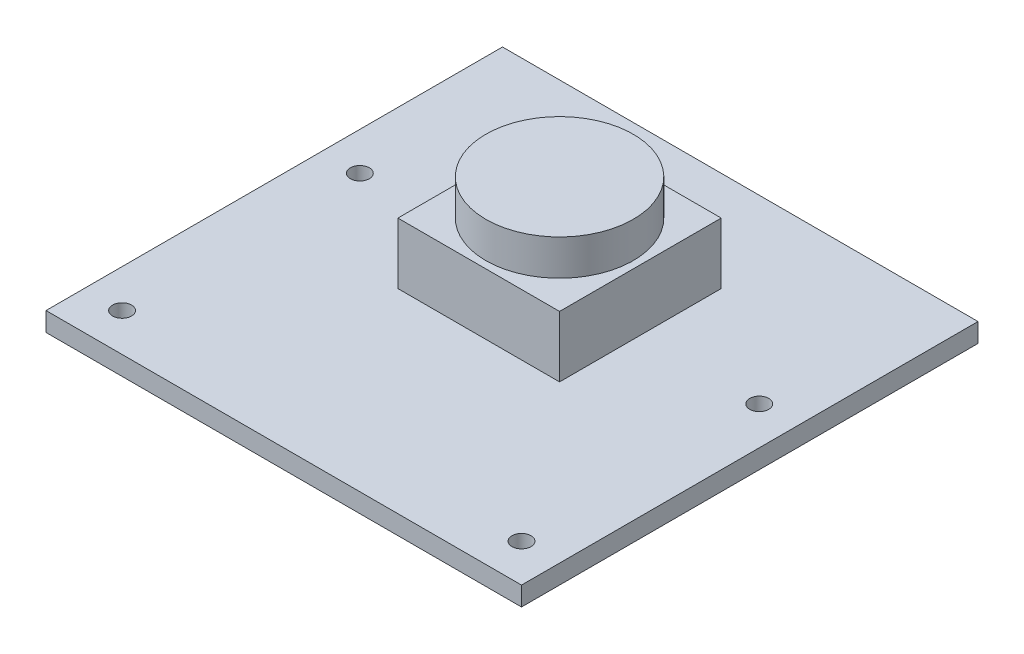
ISO-10303-21;
HEADER;
FILE_DESCRIPTION(('STEP AP214'),'2;1');
FILE_NAME('part.step','',(''),(''),'','','');
FILE_SCHEMA(('AUTOMOTIVE_DESIGN { 1 0 10303 214 1 1 1 1 }'));
ENDSEC;
DATA;
#1=APPLICATION_CONTEXT('core data for automotive mechanical design processes');
#2=APPLICATION_PROTOCOL_DEFINITION('international standard','automotive_design',2000,#1);
#3=PRODUCT_CONTEXT('',#1,'mechanical');
#4=PRODUCT('Part','Part','',(#3));
#5=PRODUCT_RELATED_PRODUCT_CATEGORY('part','',(#4));
#6=PRODUCT_DEFINITION_FORMATION('','',#4);
#7=PRODUCT_DEFINITION_CONTEXT('part definition',#1,'design');
#8=PRODUCT_DEFINITION('design','',#6,#7);
#9=PRODUCT_DEFINITION_SHAPE('','',#8);
#10=(LENGTH_UNIT() NAMED_UNIT(*) SI_UNIT(.MILLI.,.METRE.));
#11=(NAMED_UNIT(*) PLANE_ANGLE_UNIT() SI_UNIT($,.RADIAN.));
#12=(NAMED_UNIT(*) SI_UNIT($,.STERADIAN.) SOLID_ANGLE_UNIT());
#13=UNCERTAINTY_MEASURE_WITH_UNIT(LENGTH_MEASURE(1.E-05),#10,'distance_accuracy_value','');
#14=(GEOMETRIC_REPRESENTATION_CONTEXT(3) GLOBAL_UNCERTAINTY_ASSIGNED_CONTEXT((#13)) GLOBAL_UNIT_ASSIGNED_CONTEXT((#10,
#11,#12)) REPRESENTATION_CONTEXT('',''));
#15=CARTESIAN_POINT('',(0.,0.,0.));
#16=DIRECTION('',(0.,0.,1.));
#17=DIRECTION('',(1.,0.,0.));
#18=AXIS2_PLACEMENT_3D('',#15,#16,#17);
#19=CARTESIAN_POINT('',(0.,1.,0.));
#20=DIRECTION('',(0.,-1.,0.));
#21=DIRECTION('',(0.,0.,-1.));
#22=AXIS2_PLACEMENT_3D('',#19,#20,#21);
#23=PLANE('',#22);
#24=DIRECTION('',(0.,0.,-1.));
#25=VECTOR('',#24,1.);
#26=CARTESIAN_POINT('',(12.5,1.,12.));
#27=LINE('',#26,#25);
#28=CARTESIAN_POINT('',(12.5,1.,12.));
#29=VERTEX_POINT('',#28);
#30=CARTESIAN_POINT('',(12.5,1.,-12.));
#31=VERTEX_POINT('',#30);
#32=EDGE_CURVE('E152',#29,#31,#27,.T.);
#33=ORIENTED_EDGE('',*,*,#32,.T.);
#34=DIRECTION('',(-1.,0.,0.));
#35=VECTOR('',#34,1.);
#36=CARTESIAN_POINT('',(-12.5,1.,-12.));
#37=LINE('',#36,#35);
#38=CARTESIAN_POINT('',(-12.5,1.,-12.));
#39=VERTEX_POINT('',#38);
#40=EDGE_CURVE('E155',#31,#39,#37,.T.);
#41=ORIENTED_EDGE('',*,*,#40,.T.);
#42=DIRECTION('',(0.,0.,1.));
#43=VECTOR('',#42,1.);
#44=CARTESIAN_POINT('',(-12.5,1.,12.));
#45=LINE('',#44,#43);
#46=CARTESIAN_POINT('',(-12.5,1.,12.));
#47=VERTEX_POINT('',#46);
#48=EDGE_CURVE('E158',#39,#47,#45,.T.);
#49=ORIENTED_EDGE('',*,*,#48,.T.);
#50=DIRECTION('',(1.,0.,0.));
#51=VECTOR('',#50,1.);
#52=CARTESIAN_POINT('',(-12.5,1.,12.));
#53=LINE('',#52,#51);
#54=EDGE_CURVE('E160',#47,#29,#53,.T.);
#55=ORIENTED_EDGE('',*,*,#54,.T.);
#56=EDGE_LOOP('',(#33,#41,#49,#55));
#57=FACE_BOUND('',#56,.T.);
#58=CARTESIAN_POINT('',(-10.5,1.,10.));
#59=DIRECTION('',(0.,1.,0.));
#60=DIRECTION('',(0.,0.,1.));
#61=AXIS2_PLACEMENT_3D('',#58,#59,#60);
#62=CIRCLE('',#61,0.500000000000001);
#63=CARTESIAN_POINT('',(-10.5,1.,10.5));
#64=VERTEX_POINT('',#63);
#65=EDGE_CURVE('E137',#64,#64,#62,.T.);
#66=ORIENTED_EDGE('',*,*,#65,.F.);
#67=EDGE_LOOP('',(#66));
#68=FACE_BOUND('',#67,.T.);
#69=CARTESIAN_POINT('',(10.5,1.,-2.5));
#70=DIRECTION('',(0.,1.,0.));
#71=DIRECTION('',(0.,0.,-1.));
#72=AXIS2_PLACEMENT_3D('',#69,#70,#71);
#73=CIRCLE('',#72,0.500000000000001);
#74=CARTESIAN_POINT('',(10.5,1.,-3.));
#75=VERTEX_POINT('',#74);
#76=EDGE_CURVE('E122',#75,#75,#73,.T.);
#77=ORIENTED_EDGE('',*,*,#76,.F.);
#78=EDGE_LOOP('',(#77));
#79=FACE_BOUND('',#78,.T.);
#80=CARTESIAN_POINT('',(-10.5,1.,-2.5));
#81=DIRECTION('',(0.,1.,0.));
#82=DIRECTION('',(0.,0.,1.));
#83=AXIS2_PLACEMENT_3D('',#80,#81,#82);
#84=CIRCLE('',#83,0.500000000000001);
#85=CARTESIAN_POINT('',(-10.5,1.,-2.));
#86=VERTEX_POINT('',#85);
#87=EDGE_CURVE('E132',#86,#86,#84,.T.);
#88=ORIENTED_EDGE('',*,*,#87,.F.);
#89=EDGE_LOOP('',(#88));
#90=FACE_BOUND('',#89,.T.);
#91=CARTESIAN_POINT('',(10.5,1.,10.));
#92=DIRECTION('',(0.,1.,0.));
#93=DIRECTION('',(0.,0.,-1.));
#94=AXIS2_PLACEMENT_3D('',#91,#92,#93);
#95=CIRCLE('',#94,0.500000000000001);
#96=CARTESIAN_POINT('',(10.5,1.,9.5));
#97=VERTEX_POINT('',#96);
#98=EDGE_CURVE('E138',#97,#97,#95,.T.);
#99=ORIENTED_EDGE('',*,*,#98,.F.);
#100=EDGE_LOOP('',(#99));
#101=FACE_BOUND('',#100,.T.);
#102=DIRECTION('',(0.,0.,-1.));
#103=VECTOR('',#102,1.);
#104=CARTESIAN_POINT('',(4.25,1.,1.75));
#105=LINE('',#104,#103);
#106=CARTESIAN_POINT('',(4.25,1.,1.75));
#107=VERTEX_POINT('',#106);
#108=CARTESIAN_POINT('',(4.25,1.,-6.75));
#109=VERTEX_POINT('',#108);
#110=EDGE_CURVE('E121',#107,#109,#105,.T.);
#111=ORIENTED_EDGE('',*,*,#110,.F.);
#112=DIRECTION('',(1.,0.,0.));
#113=VECTOR('',#112,1.);
#114=CARTESIAN_POINT('',(-4.25,1.,1.75));
#115=LINE('',#114,#113);
#116=CARTESIAN_POINT('',(-4.25,1.,1.75));
#117=VERTEX_POINT('',#116);
#118=EDGE_CURVE('E118',#117,#107,#115,.T.);
#119=ORIENTED_EDGE('',*,*,#118,.F.);
#120=DIRECTION('',(0.,0.,1.));
#121=VECTOR('',#120,1.);
#122=CARTESIAN_POINT('',(-4.25,1.,1.75));
#123=LINE('',#122,#121);
#124=CARTESIAN_POINT('',(-4.25,1.,-6.75));
#125=VERTEX_POINT('',#124);
#126=EDGE_CURVE('E56',#125,#117,#123,.T.);
#127=ORIENTED_EDGE('',*,*,#126,.F.);
#128=DIRECTION('',(-1.,0.,0.));
#129=VECTOR('',#128,1.);
#130=CARTESIAN_POINT('',(-4.25,1.,-6.75));
#131=LINE('',#130,#129);
#132=EDGE_CURVE('E51',#109,#125,#131,.T.);
#133=ORIENTED_EDGE('',*,*,#132,.F.);
#134=EDGE_LOOP('',(#111,#119,#127,#133));
#135=FACE_BOUND('',#134,.T.);
#136=ADVANCED_FACE('F35',(#57,#68,#79,#90,#101,#135),#23,.F.);
#137=CARTESIAN_POINT('',(12.5,1.,12.));
#138=DIRECTION('',(-1.,0.,0.));
#139=DIRECTION('',(0.,0.,1.));
#140=AXIS2_PLACEMENT_3D('',#137,#138,#139);
#141=PLANE('',#140);
#142=DIRECTION('',(0.,0.,-1.));
#143=VECTOR('',#142,1.);
#144=CARTESIAN_POINT('',(12.5,0.,12.));
#145=LINE('',#144,#143);
#146=CARTESIAN_POINT('',(12.5,0.,12.));
#147=VERTEX_POINT('',#146);
#148=CARTESIAN_POINT('',(12.5,0.,-12.));
#149=VERTEX_POINT('',#148);
#150=EDGE_CURVE('E149',#147,#149,#145,.T.);
#151=ORIENTED_EDGE('',*,*,#150,.T.);
#152=DIRECTION('',(0.,-1.,0.));
#153=VECTOR('',#152,1.);
#154=CARTESIAN_POINT('',(12.5,1.,-12.));
#155=LINE('',#154,#153);
#156=EDGE_CURVE('E39',#31,#149,#155,.T.);
#157=ORIENTED_EDGE('',*,*,#156,.F.);
#158=ORIENTED_EDGE('',*,*,#32,.F.);
#159=DIRECTION('',(0.,-1.,0.));
#160=VECTOR('',#159,1.);
#161=CARTESIAN_POINT('',(12.5,1.,12.));
#162=LINE('',#161,#160);
#163=EDGE_CURVE('E162',#29,#147,#162,.T.);
#164=ORIENTED_EDGE('',*,*,#163,.T.);
#165=EDGE_LOOP('',(#151,#157,#158,#164));
#166=FACE_BOUND('',#165,.T.);
#167=ADVANCED_FACE('F37',(#166),#141,.F.);
#168=CARTESIAN_POINT('',(-12.5,1.,-12.));
#169=DIRECTION('',(0.,0.,1.));
#170=DIRECTION('',(1.,0.,0.));
#171=AXIS2_PLACEMENT_3D('',#168,#169,#170);
#172=PLANE('',#171);
#173=DIRECTION('',(-1.,0.,0.));
#174=VECTOR('',#173,1.);
#175=CARTESIAN_POINT('',(-12.5,0.,-12.));
#176=LINE('',#175,#174);
#177=CARTESIAN_POINT('',(-12.5,0.,-12.));
#178=VERTEX_POINT('',#177);
#179=EDGE_CURVE('E165',#149,#178,#176,.T.);
#180=ORIENTED_EDGE('',*,*,#179,.T.);
#181=DIRECTION('',(0.,-1.,0.));
#182=VECTOR('',#181,1.);
#183=CARTESIAN_POINT('',(-12.5,1.,-12.));
#184=LINE('',#183,#182);
#185=EDGE_CURVE('E174',#39,#178,#184,.T.);
#186=ORIENTED_EDGE('',*,*,#185,.F.);
#187=ORIENTED_EDGE('',*,*,#40,.F.);
#188=ORIENTED_EDGE('',*,*,#156,.T.);
#189=EDGE_LOOP('',(#180,#186,#187,#188));
#190=FACE_BOUND('',#189,.T.);
#191=ADVANCED_FACE('F183',(#190),#172,.F.);
#192=CARTESIAN_POINT('',(-12.5,1.,12.));
#193=DIRECTION('',(1.,0.,0.));
#194=DIRECTION('',(0.,0.,-1.));
#195=AXIS2_PLACEMENT_3D('',#192,#193,#194);
#196=PLANE('',#195);
#197=DIRECTION('',(0.,0.,1.));
#198=VECTOR('',#197,1.);
#199=CARTESIAN_POINT('',(-12.5,0.,12.));
#200=LINE('',#199,#198);
#201=CARTESIAN_POINT('',(-12.5,0.,12.));
#202=VERTEX_POINT('',#201);
#203=EDGE_CURVE('E167',#178,#202,#200,.T.);
#204=ORIENTED_EDGE('',*,*,#203,.T.);
#205=DIRECTION('',(0.,-1.,0.));
#206=VECTOR('',#205,1.);
#207=CARTESIAN_POINT('',(-12.5,1.,12.));
#208=LINE('',#207,#206);
#209=EDGE_CURVE('E172',#47,#202,#208,.T.);
#210=ORIENTED_EDGE('',*,*,#209,.F.);
#211=ORIENTED_EDGE('',*,*,#48,.F.);
#212=ORIENTED_EDGE('',*,*,#185,.T.);
#213=EDGE_LOOP('',(#204,#210,#211,#212));
#214=FACE_BOUND('',#213,.T.);
#215=ADVANCED_FACE('F192',(#214),#196,.F.);
#216=CARTESIAN_POINT('',(-12.5,1.,12.));
#217=DIRECTION('',(0.,0.,-1.));
#218=DIRECTION('',(-1.,0.,0.));
#219=AXIS2_PLACEMENT_3D('',#216,#217,#218);
#220=PLANE('',#219);
#221=DIRECTION('',(1.,0.,0.));
#222=VECTOR('',#221,1.);
#223=CARTESIAN_POINT('',(-12.5,0.,12.));
#224=LINE('',#223,#222);
#225=EDGE_CURVE('E156',#202,#147,#224,.T.);
#226=ORIENTED_EDGE('',*,*,#225,.T.);
#227=ORIENTED_EDGE('',*,*,#163,.F.);
#228=ORIENTED_EDGE('',*,*,#54,.F.);
#229=ORIENTED_EDGE('',*,*,#209,.T.);
#230=EDGE_LOOP('',(#226,#227,#228,#229));
#231=FACE_BOUND('',#230,.T.);
#232=ADVANCED_FACE('F195',(#231),#220,.F.);
#233=CARTESIAN_POINT('',(0.,0.,0.));
#234=DIRECTION('',(0.,-1.,0.));
#235=DIRECTION('',(0.,0.,-1.));
#236=AXIS2_PLACEMENT_3D('',#233,#234,#235);
#237=PLANE('',#236);
#238=CARTESIAN_POINT('',(10.5,0.,10.));
#239=DIRECTION('',(0.,1.,0.));
#240=DIRECTION('',(0.,0.,-1.));
#241=AXIS2_PLACEMENT_3D('',#238,#239,#240);
#242=CIRCLE('',#241,0.500000000000001);
#243=CARTESIAN_POINT('',(10.5,0.,9.5));
#244=VERTEX_POINT('',#243);
#245=EDGE_CURVE('E134',#244,#244,#242,.T.);
#246=ORIENTED_EDGE('',*,*,#245,.T.);
#247=EDGE_LOOP('',(#246));
#248=FACE_BOUND('',#247,.T.);
#249=CARTESIAN_POINT('',(-10.5,0.,-2.5));
#250=DIRECTION('',(0.,1.,0.));
#251=DIRECTION('',(0.,0.,1.));
#252=AXIS2_PLACEMENT_3D('',#249,#250,#251);
#253=CIRCLE('',#252,0.500000000000001);
#254=CARTESIAN_POINT('',(-10.5,0.,-2.));
#255=VERTEX_POINT('',#254);
#256=EDGE_CURVE('E141',#255,#255,#253,.T.);
#257=ORIENTED_EDGE('',*,*,#256,.T.);
#258=EDGE_LOOP('',(#257));
#259=FACE_BOUND('',#258,.T.);
#260=CARTESIAN_POINT('',(10.5,0.,-2.5));
#261=DIRECTION('',(0.,1.,0.));
#262=DIRECTION('',(0.,0.,-1.));
#263=AXIS2_PLACEMENT_3D('',#260,#261,#262);
#264=CIRCLE('',#263,0.500000000000001);
#265=CARTESIAN_POINT('',(10.5,0.,-3.));
#266=VERTEX_POINT('',#265);
#267=EDGE_CURVE('E125',#266,#266,#264,.T.);
#268=ORIENTED_EDGE('',*,*,#267,.T.);
#269=EDGE_LOOP('',(#268));
#270=FACE_BOUND('',#269,.T.);
#271=CARTESIAN_POINT('',(-10.5,0.,10.));
#272=DIRECTION('',(0.,1.,0.));
#273=DIRECTION('',(0.,0.,1.));
#274=AXIS2_PLACEMENT_3D('',#271,#272,#273);
#275=CIRCLE('',#274,0.500000000000001);
#276=CARTESIAN_POINT('',(-10.5,0.,10.5));
#277=VERTEX_POINT('',#276);
#278=EDGE_CURVE('E146',#277,#277,#275,.T.);
#279=ORIENTED_EDGE('',*,*,#278,.T.);
#280=EDGE_LOOP('',(#279));
#281=FACE_BOUND('',#280,.T.);
#282=ORIENTED_EDGE('',*,*,#150,.F.);
#283=ORIENTED_EDGE('',*,*,#225,.F.);
#284=ORIENTED_EDGE('',*,*,#203,.F.);
#285=ORIENTED_EDGE('',*,*,#179,.F.);
#286=EDGE_LOOP('',(#282,#283,#284,#285));
#287=FACE_BOUND('',#286,.T.);
#288=ADVANCED_FACE('F190',(#248,#259,#270,#281,#287),#237,.T.);
#289=CARTESIAN_POINT('',(-10.5,0.,10.));
#290=DIRECTION('',(0.,1.,0.));
#291=DIRECTION('',(0.,0.,1.));
#292=AXIS2_PLACEMENT_3D('',#289,#290,#291);
#293=CYLINDRICAL_SURFACE('',#292,0.500000000000001);
#294=ORIENTED_EDGE('',*,*,#278,.F.);
#295=EDGE_LOOP('',(#294));
#296=FACE_BOUND('',#295,.T.);
#297=ORIENTED_EDGE('',*,*,#65,.T.);
#298=EDGE_LOOP('',(#297));
#299=FACE_BOUND('',#298,.T.);
#300=ADVANCED_FACE('F254',(#296,#299),#293,.F.);
#301=CARTESIAN_POINT('',(10.5,0.,-2.5));
#302=DIRECTION('',(0.,1.,0.));
#303=DIRECTION('',(0.,0.,1.));
#304=AXIS2_PLACEMENT_3D('',#301,#302,#303);
#305=CYLINDRICAL_SURFACE('',#304,0.500000000000001);
#306=ORIENTED_EDGE('',*,*,#267,.F.);
#307=EDGE_LOOP('',(#306));
#308=FACE_BOUND('',#307,.T.);
#309=ORIENTED_EDGE('',*,*,#76,.T.);
#310=EDGE_LOOP('',(#309));
#311=FACE_BOUND('',#310,.T.);
#312=ADVANCED_FACE('F250',(#308,#311),#305,.F.);
#313=CARTESIAN_POINT('',(-10.5,0.,-2.5));
#314=DIRECTION('',(0.,1.,0.));
#315=DIRECTION('',(0.,0.,1.));
#316=AXIS2_PLACEMENT_3D('',#313,#314,#315);
#317=CYLINDRICAL_SURFACE('',#316,0.500000000000001);
#318=ORIENTED_EDGE('',*,*,#256,.F.);
#319=EDGE_LOOP('',(#318));
#320=FACE_BOUND('',#319,.T.);
#321=ORIENTED_EDGE('',*,*,#87,.T.);
#322=EDGE_LOOP('',(#321));
#323=FACE_BOUND('',#322,.T.);
#324=ADVANCED_FACE('F253',(#320,#323),#317,.F.);
#325=CARTESIAN_POINT('',(10.5,0.,10.));
#326=DIRECTION('',(0.,1.,0.));
#327=DIRECTION('',(0.,0.,1.));
#328=AXIS2_PLACEMENT_3D('',#325,#326,#327);
#329=CYLINDRICAL_SURFACE('',#328,0.500000000000001);
#330=ORIENTED_EDGE('',*,*,#245,.F.);
#331=EDGE_LOOP('',(#330));
#332=FACE_BOUND('',#331,.T.);
#333=ORIENTED_EDGE('',*,*,#98,.T.);
#334=EDGE_LOOP('',(#333));
#335=FACE_BOUND('',#334,.T.);
#336=ADVANCED_FACE('F249',(#332,#335),#329,.F.);
#337=CARTESIAN_POINT('',(4.25,4.21,1.75));
#338=DIRECTION('',(-1.,0.,0.));
#339=DIRECTION('',(0.,0.,1.));
#340=AXIS2_PLACEMENT_3D('',#337,#338,#339);
#341=PLANE('',#340);
#342=ORIENTED_EDGE('',*,*,#110,.T.);
#343=DIRECTION('',(0.,-1.,0.));
#344=VECTOR('',#343,1.);
#345=CARTESIAN_POINT('',(4.25,4.21,-6.75));
#346=LINE('',#345,#344);
#347=CARTESIAN_POINT('',(4.25,4.21,-6.75));
#348=VERTEX_POINT('',#347);
#349=EDGE_CURVE('E102',#348,#109,#346,.T.);
#350=ORIENTED_EDGE('',*,*,#349,.F.);
#351=DIRECTION('',(0.,0.,-1.));
#352=VECTOR('',#351,1.);
#353=CARTESIAN_POINT('',(4.25,4.21,1.75));
#354=LINE('',#353,#352);
#355=CARTESIAN_POINT('',(4.25,4.21,1.75));
#356=VERTEX_POINT('',#355);
#357=EDGE_CURVE('E109',#356,#348,#354,.T.);
#358=ORIENTED_EDGE('',*,*,#357,.F.);
#359=DIRECTION('',(0.,-1.,0.));
#360=VECTOR('',#359,1.);
#361=CARTESIAN_POINT('',(4.25,4.21,1.75));
#362=LINE('',#361,#360);
#363=EDGE_CURVE('E213',#356,#107,#362,.T.);
#364=ORIENTED_EDGE('',*,*,#363,.T.);
#365=EDGE_LOOP('',(#342,#350,#358,#364));
#366=FACE_BOUND('',#365,.T.);
#367=ADVANCED_FACE('F120',(#366),#341,.F.);
#368=CARTESIAN_POINT('',(-4.25,4.21,-6.75));
#369=DIRECTION('',(0.,0.,1.));
#370=DIRECTION('',(1.,0.,0.));
#371=AXIS2_PLACEMENT_3D('',#368,#369,#370);
#372=PLANE('',#371);
#373=ORIENTED_EDGE('',*,*,#132,.T.);
#374=DIRECTION('',(0.,-1.,0.));
#375=VECTOR('',#374,1.);
#376=CARTESIAN_POINT('',(-4.25,4.21,-6.75));
#377=LINE('',#376,#375);
#378=CARTESIAN_POINT('',(-4.25,4.21,-6.75));
#379=VERTEX_POINT('',#378);
#380=EDGE_CURVE('E105',#379,#125,#377,.T.);
#381=ORIENTED_EDGE('',*,*,#380,.F.);
#382=DIRECTION('',(-1.,0.,0.));
#383=VECTOR('',#382,1.);
#384=CARTESIAN_POINT('',(-4.25,4.21,-6.75));
#385=LINE('',#384,#383);
#386=EDGE_CURVE('E98',#348,#379,#385,.T.);
#387=ORIENTED_EDGE('',*,*,#386,.F.);
#388=ORIENTED_EDGE('',*,*,#349,.T.);
#389=EDGE_LOOP('',(#373,#381,#387,#388));
#390=FACE_BOUND('',#389,.T.);
#391=ADVANCED_FACE('F100',(#390),#372,.F.);
#392=CARTESIAN_POINT('',(-4.25,4.21,1.75));
#393=DIRECTION('',(1.,0.,0.));
#394=DIRECTION('',(0.,0.,-1.));
#395=AXIS2_PLACEMENT_3D('',#392,#393,#394);
#396=PLANE('',#395);
#397=ORIENTED_EDGE('',*,*,#126,.T.);
#398=DIRECTION('',(0.,-1.,0.));
#399=VECTOR('',#398,1.);
#400=CARTESIAN_POINT('',(-4.25,4.21,1.75));
#401=LINE('',#400,#399);
#402=CARTESIAN_POINT('',(-4.25,4.21,1.75));
#403=VERTEX_POINT('',#402);
#404=EDGE_CURVE('E127',#403,#117,#401,.T.);
#405=ORIENTED_EDGE('',*,*,#404,.F.);
#406=DIRECTION('',(0.,0.,1.));
#407=VECTOR('',#406,1.);
#408=CARTESIAN_POINT('',(-4.25,4.21,1.75));
#409=LINE('',#408,#407);
#410=EDGE_CURVE('E108',#379,#403,#409,.T.);
#411=ORIENTED_EDGE('',*,*,#410,.F.);
#412=ORIENTED_EDGE('',*,*,#380,.T.);
#413=EDGE_LOOP('',(#397,#405,#411,#412));
#414=FACE_BOUND('',#413,.T.);
#415=ADVANCED_FACE('F238',(#414),#396,.F.);
#416=CARTESIAN_POINT('',(-4.25,4.21,1.75));
#417=DIRECTION('',(0.,0.,-1.));
#418=DIRECTION('',(-1.,0.,0.));
#419=AXIS2_PLACEMENT_3D('',#416,#417,#418);
#420=PLANE('',#419);
#421=ORIENTED_EDGE('',*,*,#118,.T.);
#422=ORIENTED_EDGE('',*,*,#363,.F.);
#423=DIRECTION('',(1.,0.,0.));
#424=VECTOR('',#423,1.);
#425=CARTESIAN_POINT('',(-4.25,4.21,1.75));
#426=LINE('',#425,#424);
#427=EDGE_CURVE('E114',#403,#356,#426,.T.);
#428=ORIENTED_EDGE('',*,*,#427,.F.);
#429=ORIENTED_EDGE('',*,*,#404,.T.);
#430=EDGE_LOOP('',(#421,#422,#428,#429));
#431=FACE_BOUND('',#430,.T.);
#432=ADVANCED_FACE('F212',(#431),#420,.F.);
#433=CARTESIAN_POINT('',(0.,4.21,0.));
#434=DIRECTION('',(0.,-1.,0.));
#435=DIRECTION('',(0.,0.,-1.));
#436=AXIS2_PLACEMENT_3D('',#433,#434,#435);
#437=PLANE('',#436);
#438=CARTESIAN_POINT('',(0.,4.21,-2.5));
#439=DIRECTION('',(0.,1.,0.));
#440=DIRECTION('',(0.,0.,1.));
#441=AXIS2_PLACEMENT_3D('',#438,#439,#440);
#442=CIRCLE('',#441,3.87655728767913);
#443=CARTESIAN_POINT('',(0.,4.21,1.37655728767913));
#444=VERTEX_POINT('',#443);
#445=EDGE_CURVE('E11',#444,#444,#442,.T.);
#446=ORIENTED_EDGE('',*,*,#445,.F.);
#447=EDGE_LOOP('',(#446));
#448=FACE_BOUND('',#447,.T.);
#449=ORIENTED_EDGE('',*,*,#357,.T.);
#450=ORIENTED_EDGE('',*,*,#386,.T.);
#451=ORIENTED_EDGE('',*,*,#410,.T.);
#452=ORIENTED_EDGE('',*,*,#427,.T.);
#453=EDGE_LOOP('',(#449,#450,#451,#452));
#454=FACE_BOUND('',#453,.T.);
#455=ADVANCED_FACE('F112',(#448,#454),#437,.F.);
#456=CARTESIAN_POINT('',(0.,6.09,-2.5));
#457=DIRECTION('',(0.,-1.,0.));
#458=DIRECTION('',(0.,0.,-1.));
#459=AXIS2_PLACEMENT_3D('',#456,#457,#458);
#460=CYLINDRICAL_SURFACE('',#459,3.87655728767913);
#461=CARTESIAN_POINT('',(0.,6.09,-2.5));
#462=DIRECTION('',(0.,1.,0.));
#463=DIRECTION('',(0.,0.,1.));
#464=AXIS2_PLACEMENT_3D('',#461,#462,#463);
#465=CIRCLE('',#464,3.87655728767913);
#466=CARTESIAN_POINT('',(0.,6.09,1.37655728767913));
#467=VERTEX_POINT('',#466);
#468=EDGE_CURVE('E208',#467,#467,#465,.T.);
#469=ORIENTED_EDGE('',*,*,#468,.F.);
#470=EDGE_LOOP('',(#469));
#471=FACE_BOUND('',#470,.T.);
#472=ORIENTED_EDGE('',*,*,#445,.T.);
#473=EDGE_LOOP('',(#472));
#474=FACE_BOUND('',#473,.T.);
#475=ADVANCED_FACE('F227',(#471,#474),#460,.T.);
#476=CARTESIAN_POINT('',(0.,6.09,-2.5));
#477=DIRECTION('',(0.,1.,0.));
#478=DIRECTION('',(0.,0.,1.));
#479=AXIS2_PLACEMENT_3D('',#476,#477,#478);
#480=PLANE('',#479);
#481=ORIENTED_EDGE('',*,*,#468,.T.);
#482=EDGE_LOOP('',(#481));
#483=FACE_BOUND('',#482,.T.);
#484=ADVANCED_FACE('F225',(#483),#480,.T.);
#485=CLOSED_SHELL('',(#136,#167,#191,#215,#232,#288,#300,#312,#324,#336,#367,#391,#415,#432,
#455,#475,#484));
#486=MANIFOLD_SOLID_BREP('B2',#485);
#487=ADVANCED_BREP_SHAPE_REPRESENTATION('',(#18,#486),#14);
#488=SHAPE_DEFINITION_REPRESENTATION(#9,#487);
ENDSEC;
END-ISO-10303-21;
